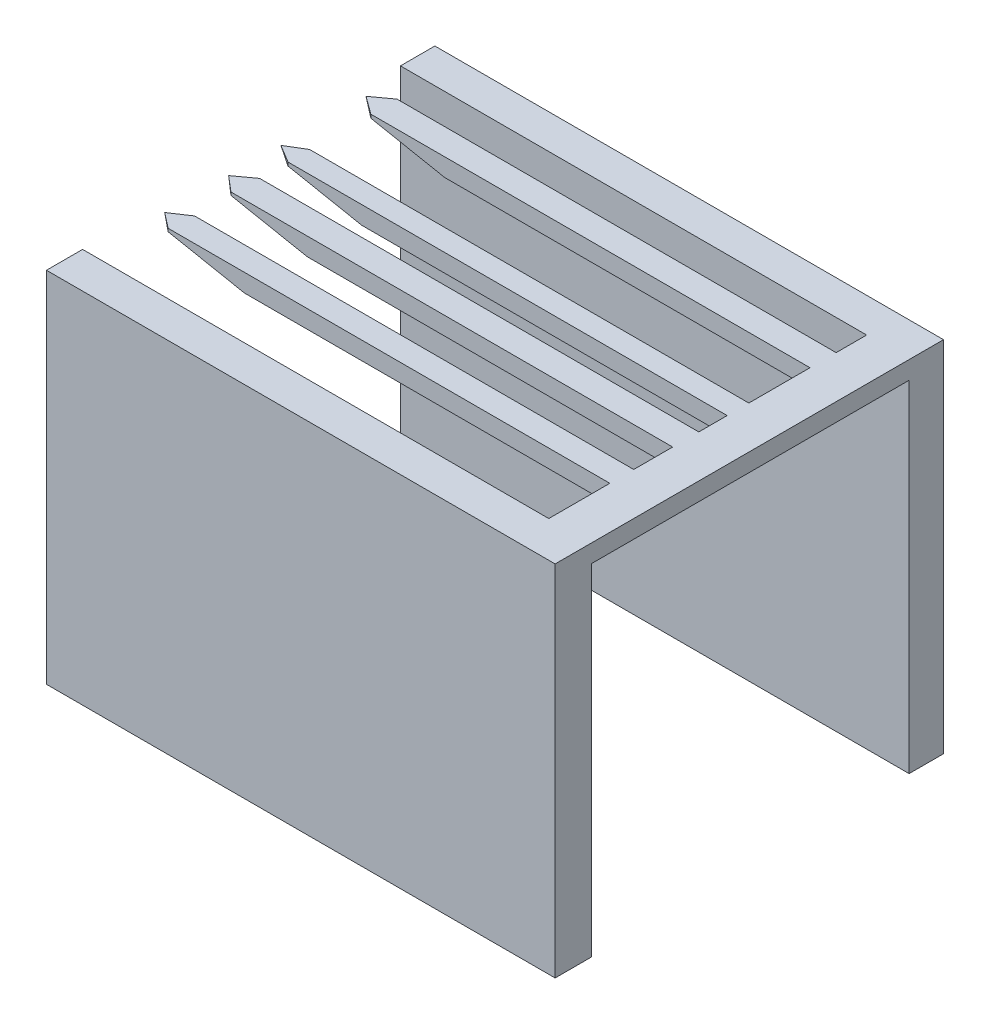
ISO-10303-21;
HEADER;
FILE_DESCRIPTION(('STEP AP214'),'2;1');
FILE_NAME('part.step','',(''),(''),'','','');
FILE_SCHEMA(('AUTOMOTIVE_DESIGN { 1 0 10303 214 1 1 1 1 }'));
ENDSEC;
DATA;
#1=APPLICATION_CONTEXT('core data for automotive mechanical design processes');
#2=APPLICATION_PROTOCOL_DEFINITION('international standard','automotive_design',2000,#1);
#3=PRODUCT_CONTEXT('',#1,'mechanical');
#4=PRODUCT('Part','Part','',(#3));
#5=PRODUCT_RELATED_PRODUCT_CATEGORY('part','',(#4));
#6=PRODUCT_DEFINITION_FORMATION('','',#4);
#7=PRODUCT_DEFINITION_CONTEXT('part definition',#1,'design');
#8=PRODUCT_DEFINITION('design','',#6,#7);
#9=PRODUCT_DEFINITION_SHAPE('','',#8);
#10=(LENGTH_UNIT() NAMED_UNIT(*) SI_UNIT(.MILLI.,.METRE.));
#11=(NAMED_UNIT(*) PLANE_ANGLE_UNIT() SI_UNIT($,.RADIAN.));
#12=(NAMED_UNIT(*) SI_UNIT($,.STERADIAN.) SOLID_ANGLE_UNIT());
#13=UNCERTAINTY_MEASURE_WITH_UNIT(LENGTH_MEASURE(1.E-05),#10,'distance_accuracy_value','');
#14=(GEOMETRIC_REPRESENTATION_CONTEXT(3) GLOBAL_UNCERTAINTY_ASSIGNED_CONTEXT((#13)) GLOBAL_UNIT_ASSIGNED_CONTEXT((#10,
#11,#12)) REPRESENTATION_CONTEXT('',''));
#15=CARTESIAN_POINT('',(0.,0.,0.));
#16=DIRECTION('',(0.,0.,1.));
#17=DIRECTION('',(1.,0.,0.));
#18=AXIS2_PLACEMENT_3D('',#15,#16,#17);
#19=CARTESIAN_POINT('',(0.,95.,0.));
#20=DIRECTION('',(0.,1.,0.));
#21=DIRECTION('',(0.,0.,1.));
#22=AXIS2_PLACEMENT_3D('',#19,#20,#21);
#23=PLANE('',#22);
#24=DIRECTION('',(0.,0.,-1.));
#25=VECTOR('',#24,1.);
#26=CARTESIAN_POINT('',(-26.0345797095387,95.,85.9286159941062));
#27=LINE('',#26,#25);
#28=CARTESIAN_POINT('',(-26.0345797095387,95.,20.9286159941062));
#29=VERTEX_POINT('',#28);
#30=CARTESIAN_POINT('',(-26.0345797095387,95.,13.6408421843065));
#31=VERTEX_POINT('',#30);
#32=EDGE_CURVE('E261',#29,#31,#27,.T.);
#33=ORIENTED_EDGE('',*,*,#32,.T.);
#34=DIRECTION('',(1.,0.,0.));
#35=VECTOR('',#34,1.);
#36=CARTESIAN_POINT('',(0.,95.,13.6408421843065));
#37=LINE('',#36,#35);
#38=CARTESIAN_POINT('',(75.8457437898929,95.,13.6408421843065));
#39=VERTEX_POINT('',#38);
#40=EDGE_CURVE('E297',#31,#39,#37,.T.);
#41=ORIENTED_EDGE('',*,*,#40,.T.);
#42=DIRECTION('',(0.,0.,1.));
#43=VECTOR('',#42,1.);
#44=CARTESIAN_POINT('',(75.8457437898929,95.,0.));
#45=LINE('',#44,#43);
#46=CARTESIAN_POINT('',(75.8457437898929,95.,5.13862822737356));
#47=VERTEX_POINT('',#46);
#48=EDGE_CURVE('E293',#47,#39,#45,.T.);
#49=ORIENTED_EDGE('',*,*,#48,.F.);
#50=DIRECTION('',(1.,0.,0.));
#51=VECTOR('',#50,1.);
#52=CARTESIAN_POINT('',(0.,95.,5.13862822737356));
#53=LINE('',#52,#51);
#54=CARTESIAN_POINT('',(87.6897438341907,95.,5.13862822737356));
#55=VERTEX_POINT('',#54);
#56=EDGE_CURVE('E290',#47,#55,#53,.T.);
#57=ORIENTED_EDGE('',*,*,#56,.T.);
#58=DIRECTION('',(0.,0.,1.));
#59=VECTOR('',#58,1.);
#60=CARTESIAN_POINT('',(87.6897438341907,95.,0.));
#61=LINE('',#60,#59);
#62=CARTESIAN_POINT('',(87.6897438341907,95.,93.7695971739275));
#63=VERTEX_POINT('',#62);
#64=EDGE_CURVE('E282',#55,#63,#61,.T.);
#65=ORIENTED_EDGE('',*,*,#64,.T.);
#66=DIRECTION('',(1.,0.,0.));
#67=VECTOR('',#66,1.);
#68=CARTESIAN_POINT('',(0.,95.,93.7695971739275));
#69=LINE('',#68,#67);
#70=CARTESIAN_POINT('',(75.8457437898929,95.,93.7695971739275));
#71=VERTEX_POINT('',#70);
#72=EDGE_CURVE('E50',#71,#63,#69,.T.);
#73=ORIENTED_EDGE('',*,*,#72,.F.);
#74=DIRECTION('',(0.,0.,1.));
#75=VECTOR('',#74,1.);
#76=CARTESIAN_POINT('',(75.8457437898929,95.,0.));
#77=LINE('',#76,#75);
#78=CARTESIAN_POINT('',(75.8457437898929,95.,76.7498621968269));
#79=VERTEX_POINT('',#78);
#80=EDGE_CURVE('E276',#79,#71,#77,.T.);
#81=ORIENTED_EDGE('',*,*,#80,.F.);
#82=DIRECTION('',(1.,0.,0.));
#83=VECTOR('',#82,1.);
#84=CARTESIAN_POINT('',(0.,95.,76.7498621968269));
#85=LINE('',#84,#83);
#86=CARTESIAN_POINT('',(-26.0345797095387,95.,76.7498621968269));
#87=VERTEX_POINT('',#86);
#88=EDGE_CURVE('E265',#87,#79,#85,.T.);
#89=ORIENTED_EDGE('',*,*,#88,.F.);
#90=CARTESIAN_POINT('',(-26.0345797095387,95.,70.0823244559463));
#91=VERTEX_POINT('',#90);
#92=EDGE_CURVE('E248',#87,#91,#27,.T.);
#93=ORIENTED_EDGE('',*,*,#92,.T.);
#94=DIRECTION('',(1.,0.,0.));
#95=VECTOR('',#94,1.);
#96=CARTESIAN_POINT('',(0.,95.,70.0823244559463));
#97=LINE('',#96,#95);
#98=CARTESIAN_POINT('',(75.8457437898929,95.,70.0823244559463));
#99=VERTEX_POINT('',#98);
#100=EDGE_CURVE('E278',#91,#99,#97,.T.);
#101=ORIENTED_EDGE('',*,*,#100,.T.);
#102=DIRECTION('',(0.,0.,1.));
#103=VECTOR('',#102,1.);
#104=CARTESIAN_POINT('',(75.8457437898929,95.,0.));
#105=LINE('',#104,#103);
#106=CARTESIAN_POINT('',(75.8457437898929,95.,59.2281932498617));
#107=VERTEX_POINT('',#106);
#108=EDGE_CURVE('E284',#107,#99,#105,.T.);
#109=ORIENTED_EDGE('',*,*,#108,.F.);
#110=DIRECTION('',(1.,0.,0.));
#111=VECTOR('',#110,1.);
#112=CARTESIAN_POINT('',(0.,95.,59.2281932498617));
#113=LINE('',#112,#111);
#114=CARTESIAN_POINT('',(-26.0345797095387,95.,59.2281932498617));
#115=VERTEX_POINT('',#114);
#116=EDGE_CURVE('E549',#115,#107,#113,.T.);
#117=ORIENTED_EDGE('',*,*,#116,.F.);
#118=CARTESIAN_POINT('',(-26.0345797095387,95.,51.9404194400621));
#119=VERTEX_POINT('',#118);
#120=EDGE_CURVE('E259',#115,#119,#27,.T.);
#121=ORIENTED_EDGE('',*,*,#120,.T.);
#122=DIRECTION('',(1.,0.,0.));
#123=VECTOR('',#122,1.);
#124=CARTESIAN_POINT('',(0.,95.,51.9404194400621));
#125=LINE('',#124,#123);
#126=CARTESIAN_POINT('',(75.8457437898929,95.,51.9404194400621));
#127=VERTEX_POINT('',#126);
#128=EDGE_CURVE('E546',#119,#127,#125,.T.);
#129=ORIENTED_EDGE('',*,*,#128,.T.);
#130=DIRECTION('',(0.,0.,1.));
#131=VECTOR('',#130,1.);
#132=CARTESIAN_POINT('',(75.8457437898929,95.,0.));
#133=LINE('',#132,#131);
#134=CARTESIAN_POINT('',(75.8457437898929,95.,44.0324095613434));
#135=VERTEX_POINT('',#134);
#136=EDGE_CURVE('E542',#135,#127,#133,.T.);
#137=ORIENTED_EDGE('',*,*,#136,.F.);
#138=DIRECTION('',(1.,0.,0.));
#139=VECTOR('',#138,1.);
#140=CARTESIAN_POINT('',(0.,95.,44.0324095613434));
#141=LINE('',#140,#139);
#142=CARTESIAN_POINT('',(-26.0345797095387,95.,44.0324095613434));
#143=VERTEX_POINT('',#142);
#144=EDGE_CURVE('E539',#143,#135,#141,.T.);
#145=ORIENTED_EDGE('',*,*,#144,.F.);
#146=CARTESIAN_POINT('',(-26.0345797095387,95.,37.985107889382));
#147=VERTEX_POINT('',#146);
#148=EDGE_CURVE('E1035',#143,#147,#27,.T.);
#149=ORIENTED_EDGE('',*,*,#148,.T.);
#150=DIRECTION('',(1.,0.,0.));
#151=VECTOR('',#150,1.);
#152=CARTESIAN_POINT('',(0.,95.,37.985107889382));
#153=LINE('',#152,#151);
#154=CARTESIAN_POINT('',(75.8457437898929,95.,37.985107889382));
#155=VERTEX_POINT('',#154);
#156=EDGE_CURVE('E536',#147,#155,#153,.T.);
#157=ORIENTED_EDGE('',*,*,#156,.T.);
#158=DIRECTION('',(0.,0.,1.));
#159=VECTOR('',#158,1.);
#160=CARTESIAN_POINT('',(75.8457437898929,95.,0.));
#161=LINE('',#160,#159);
#162=CARTESIAN_POINT('',(75.8457437898929,95.,20.9286159941062));
#163=VERTEX_POINT('',#162);
#164=EDGE_CURVE('E532',#163,#155,#161,.T.);
#165=ORIENTED_EDGE('',*,*,#164,.F.);
#166=DIRECTION('',(1.,0.,0.));
#167=VECTOR('',#166,1.);
#168=CARTESIAN_POINT('',(0.,95.,20.9286159941062));
#169=LINE('',#168,#167);
#170=EDGE_CURVE('E389',#29,#163,#169,.T.);
#171=ORIENTED_EDGE('',*,*,#170,.F.);
#172=EDGE_LOOP('',(#33,#41,#49,#57,#65,#73,#81,#89,#93,#101,#109,#117,#121,#129,#137,#145,#149,
#157,#165,#171));
#173=FACE_BOUND('',#172,.T.);
#174=ADVANCED_FACE('F41',(#173),#23,.F.);
#175=CARTESIAN_POINT('',(-9.66693073045156,95.,-13.2705990122269));
#176=DIRECTION('',(0.588792424478479,0.,0.80828428221558));
#177=DIRECTION('',(0.80828428221558,0.,-0.588792424478479));
#178=AXIS2_PLACEMENT_3D('',#175,#176,#177);
#179=PLANE('',#178);
#180=DIRECTION('',(0.798380003234807,-0.156066563926737,-0.5815776801588));
#181=VECTOR('',#180,1.);
#182=CARTESIAN_POINT('',(-10.0655938309638,91.8783978238859,-12.9801939917837));
#183=LINE('',#182,#181);
#184=CARTESIAN_POINT('',(-51.612768372986,100.,17.2847290892063));
#185=VERTEX_POINT('',#184);
#186=CARTESIAN_POINT('',(-46.6105020581459,99.0221617369668,13.6408421843065));
#187=VERTEX_POINT('',#186);
#188=EDGE_CURVE('E643',#185,#187,#183,.T.);
#189=ORIENTED_EDGE('',*,*,#188,.F.);
#190=DIRECTION('',(0.80828428221558,0.,-0.588792424478479));
#191=VECTOR('',#190,1.);
#192=CARTESIAN_POINT('',(-9.66693073045156,100.,-13.2705990122269));
#193=LINE('',#192,#191);
#194=CARTESIAN_POINT('',(-46.6105020581459,100.,13.6408421843065));
#195=VERTEX_POINT('',#194);
#196=EDGE_CURVE('E301',#185,#195,#193,.T.);
#197=ORIENTED_EDGE('',*,*,#196,.T.);
#198=DIRECTION('',(0.,1.,0.));
#199=VECTOR('',#198,1.);
#200=CARTESIAN_POINT('',(-46.6105020581459,95.,13.6408421843065));
#201=LINE('',#200,#199);
#202=EDGE_CURVE('E390',#187,#195,#201,.T.);
#203=ORIENTED_EDGE('',*,*,#202,.F.);
#204=EDGE_LOOP('',(#189,#197,#203));
#205=FACE_BOUND('',#204,.T.);
#206=ADVANCED_FACE('F642',(#205),#179,.F.);
#207=CARTESIAN_POINT('',(0.,95.,13.6408421843065));
#208=DIRECTION('',(0.,0.,1.));
#209=DIRECTION('',(1.,0.,0.));
#210=AXIS2_PLACEMENT_3D('',#207,#208,#209);
#211=PLANE('',#210);
#212=DIRECTION('',(0.981424658636506,-0.191847959124451,0.));
#213=VECTOR('',#212,1.);
#214=CARTESIAN_POINT('',(-0.958219353246181,90.0980969203405,13.6408421843065));
#215=LINE('',#214,#213);
#216=EDGE_CURVE('E639',#187,#31,#215,.T.);
#217=ORIENTED_EDGE('',*,*,#216,.F.);
#218=ORIENTED_EDGE('',*,*,#202,.T.);
#219=DIRECTION('',(1.,0.,0.));
#220=VECTOR('',#219,1.);
#221=CARTESIAN_POINT('',(0.,100.,13.6408421843065));
#222=LINE('',#221,#220);
#223=CARTESIAN_POINT('',(75.8457437898929,100.,13.6408421843065));
#224=VERTEX_POINT('',#223);
#225=EDGE_CURVE('E385',#195,#224,#222,.T.);
#226=ORIENTED_EDGE('',*,*,#225,.T.);
#227=DIRECTION('',(0.,1.,0.));
#228=VECTOR('',#227,1.);
#229=CARTESIAN_POINT('',(75.8457437898929,95.,13.6408421843065));
#230=LINE('',#229,#228);
#231=EDGE_CURVE('E394',#39,#224,#230,.T.);
#232=ORIENTED_EDGE('',*,*,#231,.F.);
#233=ORIENTED_EDGE('',*,*,#40,.F.);
#234=EDGE_LOOP('',(#217,#218,#226,#232,#233));
#235=FACE_BOUND('',#234,.T.);
#236=ADVANCED_FACE('F637',(#235),#211,.F.);
#237=CARTESIAN_POINT('',(0.,95.,76.7498621968269));
#238=DIRECTION('',(0.,0.,1.));
#239=DIRECTION('',(1.,0.,0.));
#240=AXIS2_PLACEMENT_3D('',#237,#238,#239);
#241=PLANE('',#240);
#242=DIRECTION('',(0.,1.,0.));
#243=VECTOR('',#242,1.);
#244=CARTESIAN_POINT('',(-47.3197879004241,95.,76.7498621968269));
#245=LINE('',#244,#243);
#246=CARTESIAN_POINT('',(-47.3197879004241,99.1608122590211,76.7498621968269));
#247=VERTEX_POINT('',#246);
#248=CARTESIAN_POINT('',(-47.3197879004241,100.,76.7498621968269));
#249=VERTEX_POINT('',#248);
#250=EDGE_CURVE('E268',#247,#249,#245,.T.);
#251=ORIENTED_EDGE('',*,*,#250,.F.);
#252=DIRECTION('',(0.981424658636506,-0.191847959124451,0.));
#253=VECTOR('',#252,1.);
#254=CARTESIAN_POINT('',(-0.958219353246181,90.0980969203405,76.7498621968269));
#255=LINE('',#254,#253);
#256=EDGE_CURVE('E251',#247,#87,#255,.T.);
#257=ORIENTED_EDGE('',*,*,#256,.T.);
#258=ORIENTED_EDGE('',*,*,#88,.T.);
#259=DIRECTION('',(0.,1.,0.));
#260=VECTOR('',#259,1.);
#261=CARTESIAN_POINT('',(75.8457437898929,95.,76.7498621968269));
#262=LINE('',#261,#260);
#263=CARTESIAN_POINT('',(75.8457437898929,100.,76.7498621968269));
#264=VERTEX_POINT('',#263);
#265=EDGE_CURVE('E405',#79,#264,#262,.T.);
#266=ORIENTED_EDGE('',*,*,#265,.T.);
#267=DIRECTION('',(1.,0.,0.));
#268=VECTOR('',#267,1.);
#269=CARTESIAN_POINT('',(0.,100.,76.7498621968269));
#270=LINE('',#269,#268);
#271=EDGE_CURVE('E370',#249,#264,#270,.T.);
#272=ORIENTED_EDGE('',*,*,#271,.F.);
#273=EDGE_LOOP('',(#251,#257,#258,#266,#272));
#274=FACE_BOUND('',#273,.T.);
#275=ADVANCED_FACE('F264',(#274),#241,.T.);
#276=CARTESIAN_POINT('',(-54.9809966350981,95.,70.8004526076518));
#277=DIRECTION('',(0.613342518914027,0.,-0.789817038618563));
#278=DIRECTION('',(-0.789817038618563,0.,-0.613342518914027));
#279=AXIS2_PLACEMENT_3D('',#276,#277,#278);
#280=PLANE('',#279);
#281=DIRECTION('',(-0.780568582148247,0.152584804267967,-0.606160511803252));
#282=VECTOR('',#281,1.);
#283=CARTESIAN_POINT('',(-54.3070626104895,100.526678075792,71.3238046905067));
#284=LINE('',#283,#282);
#285=CARTESIAN_POINT('',(-51.612768372986,100.,73.4160933263866));
#286=VERTEX_POINT('',#285);
#287=EDGE_CURVE('E271',#247,#286,#284,.T.);
#288=ORIENTED_EDGE('',*,*,#287,.F.);
#289=ORIENTED_EDGE('',*,*,#250,.T.);
#290=DIRECTION('',(-0.789817038618563,0.,-0.613342518914027));
#291=VECTOR('',#290,1.);
#292=CARTESIAN_POINT('',(-54.9809966350981,100.,70.8004526076518));
#293=LINE('',#292,#291);
#294=EDGE_CURVE('E366',#249,#286,#293,.T.);
#295=ORIENTED_EDGE('',*,*,#294,.T.);
#296=EDGE_LOOP('',(#288,#289,#295));
#297=FACE_BOUND('',#296,.T.);
#298=ADVANCED_FACE('F593',(#297),#280,.F.);
#299=CARTESIAN_POINT('',(18.0063853558117,95.,27.0182902348328));
#300=DIRECTION('',(0.554576347329292,0.,0.832132846955882));
#301=DIRECTION('',(0.832132846955882,0.,-0.554576347329292));
#302=AXIS2_PLACEMENT_3D('',#299,#300,#301);
#303=PLANE('',#302);
#304=DIRECTION('',(0.821337596163026,-0.160554292364096,-0.547381834127336));
#305=VECTOR('',#304,1.);
#306=CARTESIAN_POINT('',(16.8711114163857,86.6128362937523,27.774895477431));
#307=LINE('',#306,#305);
#308=CARTESIAN_POINT('',(-46.6105020581459,99.0221617369668,70.0823244559463));
#309=VERTEX_POINT('',#308);
#310=EDGE_CURVE('E57',#286,#309,#307,.T.);
#311=ORIENTED_EDGE('',*,*,#310,.F.);
#312=DIRECTION('',(0.832132846955882,0.,-0.554576347329292));
#313=VECTOR('',#312,1.);
#314=CARTESIAN_POINT('',(18.0063853558117,100.,27.0182902348328));
#315=LINE('',#314,#313);
#316=CARTESIAN_POINT('',(-46.6105020581459,100.,70.0823244559463));
#317=VERTEX_POINT('',#316);
#318=EDGE_CURVE('E362',#286,#317,#315,.T.);
#319=ORIENTED_EDGE('',*,*,#318,.T.);
#320=DIRECTION('',(0.,1.,0.));
#321=VECTOR('',#320,1.);
#322=CARTESIAN_POINT('',(-46.6105020581459,95.,70.0823244559463));
#323=LINE('',#322,#321);
#324=EDGE_CURVE('E410',#309,#317,#323,.T.);
#325=ORIENTED_EDGE('',*,*,#324,.F.);
#326=EDGE_LOOP('',(#311,#319,#325));
#327=FACE_BOUND('',#326,.T.);
#328=ADVANCED_FACE('F591',(#327),#303,.F.);
#329=CARTESIAN_POINT('',(0.,95.,70.0823244559463));
#330=DIRECTION('',(0.,0.,1.));
#331=DIRECTION('',(1.,0.,0.));
#332=AXIS2_PLACEMENT_3D('',#329,#330,#331);
#333=PLANE('',#332);
#334=DIRECTION('',(0.981424658636506,-0.191847959124451,0.));
#335=VECTOR('',#334,1.);
#336=CARTESIAN_POINT('',(-0.958219353246181,90.0980969203405,70.0823244559463));
#337=LINE('',#336,#335);
#338=EDGE_CURVE('E253',#309,#91,#337,.T.);
#339=ORIENTED_EDGE('',*,*,#338,.F.);
#340=ORIENTED_EDGE('',*,*,#324,.T.);
#341=DIRECTION('',(1.,0.,0.));
#342=VECTOR('',#341,1.);
#343=CARTESIAN_POINT('',(0.,100.,70.0823244559463));
#344=LINE('',#343,#342);
#345=CARTESIAN_POINT('',(75.8457437898929,100.,70.0823244559463));
#346=VERTEX_POINT('',#345);
#347=EDGE_CURVE('E358',#317,#346,#344,.T.);
#348=ORIENTED_EDGE('',*,*,#347,.T.);
#349=DIRECTION('',(0.,1.,0.));
#350=VECTOR('',#349,1.);
#351=CARTESIAN_POINT('',(75.8457437898929,95.,70.0823244559463));
#352=LINE('',#351,#350);
#353=EDGE_CURVE('E413',#99,#346,#352,.T.);
#354=ORIENTED_EDGE('',*,*,#353,.F.);
#355=ORIENTED_EDGE('',*,*,#100,.F.);
#356=EDGE_LOOP('',(#339,#340,#348,#354,#355));
#357=FACE_BOUND('',#356,.T.);
#358=ADVANCED_FACE('F562',(#357),#333,.F.);
#359=CARTESIAN_POINT('',(0.,95.,59.2281932498617));
#360=DIRECTION('',(0.,0.,1.));
#361=DIRECTION('',(1.,0.,0.));
#362=AXIS2_PLACEMENT_3D('',#359,#360,#361);
#363=PLANE('',#362);
#364=DIRECTION('',(0.,1.,0.));
#365=VECTOR('',#364,1.);
#366=CARTESIAN_POINT('',(-47.3197879004241,95.,59.2281932498617));
#367=LINE('',#366,#365);
#368=CARTESIAN_POINT('',(-47.3197879004241,99.1608122590211,59.2281932498617));
#369=VERTEX_POINT('',#368);
#370=CARTESIAN_POINT('',(-47.3197879004241,100.,59.2281932498617));
#371=VERTEX_POINT('',#370);
#372=EDGE_CURVE('E419',#369,#371,#367,.T.);
#373=ORIENTED_EDGE('',*,*,#372,.F.);
#374=DIRECTION('',(0.981424658636506,-0.191847959124451,0.));
#375=VECTOR('',#374,1.);
#376=CARTESIAN_POINT('',(-0.958219353246181,90.0980969203405,59.2281932498617));
#377=LINE('',#376,#375);
#378=EDGE_CURVE('E575',#369,#115,#377,.T.);
#379=ORIENTED_EDGE('',*,*,#378,.T.);
#380=ORIENTED_EDGE('',*,*,#116,.T.);
#381=DIRECTION('',(0.,1.,0.));
#382=VECTOR('',#381,1.);
#383=CARTESIAN_POINT('',(75.8457437898929,95.,59.2281932498617));
#384=LINE('',#383,#382);
#385=CARTESIAN_POINT('',(75.8457437898929,100.,59.2281932498617));
#386=VERTEX_POINT('',#385);
#387=EDGE_CURVE('E416',#107,#386,#384,.T.);
#388=ORIENTED_EDGE('',*,*,#387,.T.);
#389=DIRECTION('',(1.,0.,0.));
#390=VECTOR('',#389,1.);
#391=CARTESIAN_POINT('',(0.,100.,59.2281932498617));
#392=LINE('',#391,#390);
#393=EDGE_CURVE('E350',#371,#386,#392,.T.);
#394=ORIENTED_EDGE('',*,*,#393,.F.);
#395=EDGE_LOOP('',(#373,#379,#380,#388,#394));
#396=FACE_BOUND('',#395,.T.);
#397=ADVANCED_FACE('F573',(#396),#363,.T.);
#398=CARTESIAN_POINT('',(-49.0362862169957,95.,57.7712274476611));
#399=DIRECTION('',(0.647117658668542,0.,-0.762390146735479));
#400=DIRECTION('',(-0.762390146735479,0.,-0.647117658668542));
#401=AXIS2_PLACEMENT_3D('',#398,#399,#400);
#402=PLANE('',#401);
#403=DIRECTION('',(-0.754062150565573,0.147403352224697,-0.640048845665192));
#404=VECTOR('',#403,1.);
#405=CARTESIAN_POINT('',(-48.5365109287484,99.3986561197287,58.1954373036984));
#406=LINE('',#405,#404);
#407=CARTESIAN_POINT('',(-51.612768372986,100.,55.5843063449619));
#408=VERTEX_POINT('',#407);
#409=EDGE_CURVE('E578',#369,#408,#406,.T.);
#410=ORIENTED_EDGE('',*,*,#409,.F.);
#411=ORIENTED_EDGE('',*,*,#372,.T.);
#412=DIRECTION('',(-0.762390146735479,0.,-0.647117658668542));
#413=VECTOR('',#412,1.);
#414=CARTESIAN_POINT('',(-49.0362862169957,100.,57.7712274476611));
#415=LINE('',#414,#413);
#416=EDGE_CURVE('E346',#371,#408,#415,.T.);
#417=ORIENTED_EDGE('',*,*,#416,.T.);
#418=EDGE_LOOP('',(#410,#411,#417));
#419=FACE_BOUND('',#418,.T.);
#420=ADVANCED_FACE('F701',(#419),#402,.F.);
#421=CARTESIAN_POINT('',(8.56028474264569,95.,11.7514141166116));
#422=DIRECTION('',(0.588792424478478,0.,0.80828428221558));
#423=DIRECTION('',(0.80828428221558,0.,-0.588792424478478));
#424=AXIS2_PLACEMENT_3D('',#421,#422,#423);
#425=PLANE('',#424);
#426=DIRECTION('',(0.798380003234807,-0.156066563926737,-0.5815776801588));
#427=VECTOR('',#426,1.);
#428=CARTESIAN_POINT('',(7.71766550380877,88.4021431975788,12.3652177442005));
#429=LINE('',#428,#427);
#430=CARTESIAN_POINT('',(-46.6105020581459,99.0221617369668,51.9404194400621));
#431=VERTEX_POINT('',#430);
#432=EDGE_CURVE('E65',#408,#431,#429,.T.);
#433=ORIENTED_EDGE('',*,*,#432,.F.);
#434=DIRECTION('',(0.80828428221558,0.,-0.588792424478478));
#435=VECTOR('',#434,1.);
#436=CARTESIAN_POINT('',(8.56028474264569,100.,11.7514141166116));
#437=LINE('',#436,#435);
#438=CARTESIAN_POINT('',(-46.6105020581459,100.,51.9404194400621));
#439=VERTEX_POINT('',#438);
#440=EDGE_CURVE('E342',#408,#439,#437,.T.);
#441=ORIENTED_EDGE('',*,*,#440,.T.);
#442=DIRECTION('',(0.,1.,0.));
#443=VECTOR('',#442,1.);
#444=CARTESIAN_POINT('',(-46.6105020581459,95.,51.9404194400621));
#445=LINE('',#444,#443);
#446=EDGE_CURVE('E422',#431,#439,#445,.T.);
#447=ORIENTED_EDGE('',*,*,#446,.F.);
#448=EDGE_LOOP('',(#433,#441,#447));
#449=FACE_BOUND('',#448,.T.);
#450=ADVANCED_FACE('F698',(#449),#425,.F.);
#451=CARTESIAN_POINT('',(0.,95.,51.9404194400621));
#452=DIRECTION('',(0.,0.,1.));
#453=DIRECTION('',(1.,0.,0.));
#454=AXIS2_PLACEMENT_3D('',#451,#452,#453);
#455=PLANE('',#454);
#456=DIRECTION('',(0.981424658636506,-0.191847959124451,0.));
#457=VECTOR('',#456,1.);
#458=CARTESIAN_POINT('',(-0.958219353246181,90.0980969203405,51.9404194400621));
#459=LINE('',#458,#457);
#460=EDGE_CURVE('E696',#431,#119,#459,.T.);
#461=ORIENTED_EDGE('',*,*,#460,.F.);
#462=ORIENTED_EDGE('',*,*,#446,.T.);
#463=DIRECTION('',(1.,0.,0.));
#464=VECTOR('',#463,1.);
#465=CARTESIAN_POINT('',(0.,100.,51.9404194400621));
#466=LINE('',#465,#464);
#467=CARTESIAN_POINT('',(75.8457437898929,100.,51.9404194400621));
#468=VERTEX_POINT('',#467);
#469=EDGE_CURVE('E338',#439,#468,#466,.T.);
#470=ORIENTED_EDGE('',*,*,#469,.T.);
#471=DIRECTION('',(0.,1.,0.));
#472=VECTOR('',#471,1.);
#473=CARTESIAN_POINT('',(75.8457437898929,95.,51.9404194400621));
#474=LINE('',#473,#472);
#475=EDGE_CURVE('E425',#127,#468,#474,.T.);
#476=ORIENTED_EDGE('',*,*,#475,.F.);
#477=ORIENTED_EDGE('',*,*,#128,.F.);
#478=EDGE_LOOP('',(#461,#462,#470,#476,#477));
#479=FACE_BOUND('',#478,.T.);
#480=ADVANCED_FACE('F693',(#479),#455,.F.);
#481=CARTESIAN_POINT('',(0.,95.,44.0324095613434));
#482=DIRECTION('',(0.,0.,1.));
#483=DIRECTION('',(1.,0.,0.));
#484=AXIS2_PLACEMENT_3D('',#481,#482,#483);
#485=PLANE('',#484);
#486=DIRECTION('',(0.,1.,0.));
#487=VECTOR('',#486,1.);
#488=CARTESIAN_POINT('',(-46.6105020581459,95.,44.0324095613434));
#489=LINE('',#488,#487);
#490=CARTESIAN_POINT('',(-46.6105020581459,99.0221617369668,44.0324095613434));
#491=VERTEX_POINT('',#490);
#492=CARTESIAN_POINT('',(-46.6105020581459,100.,44.0324095613434));
#493=VERTEX_POINT('',#492);
#494=EDGE_CURVE('E431',#491,#493,#489,.T.);
#495=ORIENTED_EDGE('',*,*,#494,.F.);
#496=DIRECTION('',(0.981424658636506,-0.191847959124451,0.));
#497=VECTOR('',#496,1.);
#498=CARTESIAN_POINT('',(-0.958219353246181,90.0980969203405,44.0324095613434));
#499=LINE('',#498,#497);
#500=EDGE_CURVE('E1047',#491,#143,#499,.T.);
#501=ORIENTED_EDGE('',*,*,#500,.T.);
#502=ORIENTED_EDGE('',*,*,#144,.T.);
#503=DIRECTION('',(0.,1.,0.));
#504=VECTOR('',#503,1.);
#505=CARTESIAN_POINT('',(75.8457437898929,95.,44.0324095613434));
#506=LINE('',#505,#504);
#507=CARTESIAN_POINT('',(75.8457437898929,100.,44.0324095613434));
#508=VERTEX_POINT('',#507);
#509=EDGE_CURVE('E428',#135,#508,#506,.T.);
#510=ORIENTED_EDGE('',*,*,#509,.T.);
#511=DIRECTION('',(1.,0.,0.));
#512=VECTOR('',#511,1.);
#513=CARTESIAN_POINT('',(0.,100.,44.0324095613434));
#514=LINE('',#513,#512);
#515=EDGE_CURVE('E330',#493,#508,#514,.T.);
#516=ORIENTED_EDGE('',*,*,#515,.F.);
#517=EDGE_LOOP('',(#495,#501,#502,#510,#516));
#518=FACE_BOUND('',#517,.T.);
#519=ADVANCED_FACE('F682',(#518),#485,.T.);
#520=CARTESIAN_POINT('',(-31.9662083402864,95.,52.8842435412719));
#521=DIRECTION('',(0.517297146436974,0.,-0.85580585548836));
#522=DIRECTION('',(-0.85580585548836,0.,-0.517297146436974));
#523=AXIS2_PLACEMENT_3D('',#520,#521,#522);
#524=PLANE('',#523);
#525=DIRECTION('',(-0.844075929965487,0.164999160236026,-0.510206920351248));
#526=VECTOR('',#525,1.);
#527=CARTESIAN_POINT('',(-31.8047213945955,96.1279418103016,52.9818553251326));
#528=LINE('',#527,#526);
#529=CARTESIAN_POINT('',(-51.612768372986,100.,41.0087587253627));
#530=VERTEX_POINT('',#529);
#531=EDGE_CURVE('E674',#491,#530,#528,.T.);
#532=ORIENTED_EDGE('',*,*,#531,.F.);
#533=ORIENTED_EDGE('',*,*,#494,.T.);
#534=DIRECTION('',(-0.85580585548836,0.,-0.517297146436974));
#535=VECTOR('',#534,1.);
#536=CARTESIAN_POINT('',(-31.9662083402864,100.,52.8842435412719));
#537=LINE('',#536,#535);
#538=EDGE_CURVE('E326',#493,#530,#537,.T.);
#539=ORIENTED_EDGE('',*,*,#538,.T.);
#540=EDGE_LOOP('',(#532,#533,#539));
#541=FACE_BOUND('',#540,.T.);
#542=ADVANCED_FACE('F678',(#541),#524,.F.);
#543=CARTESIAN_POINT('',(4.34343274872568,95.,7.18568661142272));
#544=DIRECTION('',(0.517297146436974,0.,0.85580585548836));
#545=DIRECTION('',(0.85580585548836,0.,-0.517297146436974));
#546=AXIS2_PLACEMENT_3D('',#543,#544,#545);
#547=PLANE('',#546);
#548=DIRECTION('',(0.844075929965487,-0.164999160236026,-0.510206920351248));
#549=VECTOR('',#548,1.);
#550=CARTESIAN_POINT('',(3.51639977794697,89.2234026270758,7.6855918096046));
#551=LINE('',#550,#549);
#552=CARTESIAN_POINT('',(-46.6105020581459,99.0221617369668,37.985107889382));
#553=VERTEX_POINT('',#552);
#554=EDGE_CURVE('E671',#530,#553,#551,.T.);
#555=ORIENTED_EDGE('',*,*,#554,.F.);
#556=DIRECTION('',(0.85580585548836,0.,-0.517297146436974));
#557=VECTOR('',#556,1.);
#558=CARTESIAN_POINT('',(4.34343274872568,100.,7.18568661142272));
#559=LINE('',#558,#557);
#560=CARTESIAN_POINT('',(-46.6105020581459,100.,37.985107889382));
#561=VERTEX_POINT('',#560);
#562=EDGE_CURVE('E322',#530,#561,#559,.T.);
#563=ORIENTED_EDGE('',*,*,#562,.T.);
#564=DIRECTION('',(0.,1.,0.));
#565=VECTOR('',#564,1.);
#566=CARTESIAN_POINT('',(-46.6105020581459,95.,37.985107889382));
#567=LINE('',#566,#565);
#568=EDGE_CURVE('E434',#553,#561,#567,.T.);
#569=ORIENTED_EDGE('',*,*,#568,.F.);
#570=EDGE_LOOP('',(#555,#563,#569));
#571=FACE_BOUND('',#570,.T.);
#572=ADVANCED_FACE('F670',(#571),#547,.F.);
#573=CARTESIAN_POINT('',(0.,95.,37.985107889382));
#574=DIRECTION('',(0.,0.,1.));
#575=DIRECTION('',(1.,0.,0.));
#576=AXIS2_PLACEMENT_3D('',#573,#574,#575);
#577=PLANE('',#576);
#578=DIRECTION('',(0.981424658636506,-0.191847959124451,0.));
#579=VECTOR('',#578,1.);
#580=CARTESIAN_POINT('',(-0.958219353246181,90.0980969203405,37.985107889382));
#581=LINE('',#580,#579);
#582=EDGE_CURVE('E667',#553,#147,#581,.T.);
#583=ORIENTED_EDGE('',*,*,#582,.F.);
#584=ORIENTED_EDGE('',*,*,#568,.T.);
#585=DIRECTION('',(1.,0.,0.));
#586=VECTOR('',#585,1.);
#587=CARTESIAN_POINT('',(0.,100.,37.985107889382));
#588=LINE('',#587,#586);
#589=CARTESIAN_POINT('',(75.8457437898929,100.,37.985107889382));
#590=VERTEX_POINT('',#589);
#591=EDGE_CURVE('E318',#561,#590,#588,.T.);
#592=ORIENTED_EDGE('',*,*,#591,.T.);
#593=DIRECTION('',(0.,1.,0.));
#594=VECTOR('',#593,1.);
#595=CARTESIAN_POINT('',(75.8457437898929,95.,37.985107889382));
#596=LINE('',#595,#594);
#597=EDGE_CURVE('E437',#155,#590,#596,.T.);
#598=ORIENTED_EDGE('',*,*,#597,.F.);
#599=ORIENTED_EDGE('',*,*,#156,.F.);
#600=EDGE_LOOP('',(#583,#584,#592,#598,#599));
#601=FACE_BOUND('',#600,.T.);
#602=ADVANCED_FACE('F664',(#601),#577,.F.);
#603=CARTESIAN_POINT('',(0.,95.,20.9286159941062));
#604=DIRECTION('',(0.,0.,1.));
#605=DIRECTION('',(1.,0.,0.));
#606=AXIS2_PLACEMENT_3D('',#603,#604,#605);
#607=PLANE('',#606);
#608=DIRECTION('',(0.,1.,0.));
#609=VECTOR('',#608,1.);
#610=CARTESIAN_POINT('',(-46.6105020581459,95.,20.9286159941062));
#611=LINE('',#610,#609);
#612=CARTESIAN_POINT('',(-46.6105020581459,99.0221617369668,20.9286159941062));
#613=VERTEX_POINT('',#612);
#614=CARTESIAN_POINT('',(-46.6105020581459,100.,20.9286159941062));
#615=VERTEX_POINT('',#614);
#616=EDGE_CURVE('E300',#613,#615,#611,.T.);
#617=ORIENTED_EDGE('',*,*,#616,.F.);
#618=DIRECTION('',(0.981424658636506,-0.191847959124451,0.));
#619=VECTOR('',#618,1.);
#620=CARTESIAN_POINT('',(-0.958219353246181,90.0980969203405,20.9286159941062));
#621=LINE('',#620,#619);
#622=EDGE_CURVE('E258',#613,#29,#621,.T.);
#623=ORIENTED_EDGE('',*,*,#622,.T.);
#624=ORIENTED_EDGE('',*,*,#170,.T.);
#625=DIRECTION('',(0.,1.,0.));
#626=VECTOR('',#625,1.);
#627=CARTESIAN_POINT('',(75.8457437898929,95.,20.9286159941062));
#628=LINE('',#627,#626);
#629=CARTESIAN_POINT('',(75.8457437898929,100.,20.9286159941062));
#630=VERTEX_POINT('',#629);
#631=EDGE_CURVE('E440',#163,#630,#628,.T.);
#632=ORIENTED_EDGE('',*,*,#631,.T.);
#633=DIRECTION('',(1.,0.,0.));
#634=VECTOR('',#633,1.);
#635=CARTESIAN_POINT('',(0.,100.,20.9286159941062));
#636=LINE('',#635,#634);
#637=EDGE_CURVE('E310',#615,#630,#636,.T.);
#638=ORIENTED_EDGE('',*,*,#637,.F.);
#639=EDGE_LOOP('',(#617,#623,#624,#632,#638));
#640=FACE_BOUND('',#639,.T.);
#641=ADVANCED_FACE('F650',(#640),#607,.T.);
#642=CARTESIAN_POINT('',(-26.1189390332706,95.,35.8556377613709));
#643=DIRECTION('',(0.588792424478479,0.,-0.80828428221558));
#644=DIRECTION('',(-0.80828428221558,0.,-0.588792424478479));
#645=AXIS2_PLACEMENT_3D('',#642,#643,#644);
#646=PLANE('',#645);
#647=DIRECTION('',(-0.798380003234807,0.156066563926737,-0.5815776801588));
#648=VECTOR('',#647,1.);
#649=CARTESIAN_POINT('',(-26.1168843124247,95.0160888255163,35.8571345170237));
#650=LINE('',#649,#648);
#651=EDGE_CURVE('E11',#613,#185,#650,.T.);
#652=ORIENTED_EDGE('',*,*,#651,.F.);
#653=ORIENTED_EDGE('',*,*,#616,.T.);
#654=DIRECTION('',(-0.80828428221558,0.,-0.588792424478479));
#655=VECTOR('',#654,1.);
#656=CARTESIAN_POINT('',(-26.1189390332706,100.,35.8556377613709));
#657=LINE('',#656,#655);
#658=EDGE_CURVE('E305',#615,#185,#657,.T.);
#659=ORIENTED_EDGE('',*,*,#658,.T.);
#660=EDGE_LOOP('',(#652,#653,#659));
#661=FACE_BOUND('',#660,.T.);
#662=ADVANCED_FACE('F729',(#661),#646,.F.);
#663=CARTESIAN_POINT('',(75.8457437898929,95.,0.));
#664=DIRECTION('',(-1.,0.,0.));
#665=DIRECTION('',(0.,0.,1.));
#666=AXIS2_PLACEMENT_3D('',#663,#664,#665);
#667=PLANE('',#666);
#668=ORIENTED_EDGE('',*,*,#80,.T.);
#669=DIRECTION('',(0.,1.,0.));
#670=VECTOR('',#669,1.);
#671=CARTESIAN_POINT('',(75.8457437898929,95.,93.7695971739275));
#672=LINE('',#671,#670);
#673=CARTESIAN_POINT('',(75.8457437898929,100.,93.7695971739275));
#674=VERTEX_POINT('',#673);
#675=EDGE_CURVE('E306',#71,#674,#672,.T.);
#676=ORIENTED_EDGE('',*,*,#675,.T.);
#677=DIRECTION('',(0.,0.,1.));
#678=VECTOR('',#677,1.);
#679=CARTESIAN_POINT('',(75.8457437898929,100.,0.));
#680=LINE('',#679,#678);
#681=EDGE_CURVE('E374',#264,#674,#680,.T.);
#682=ORIENTED_EDGE('',*,*,#681,.F.);
#683=ORIENTED_EDGE('',*,*,#265,.F.);
#684=EDGE_LOOP('',(#668,#676,#682,#683));
#685=FACE_BOUND('',#684,.T.);
#686=ADVANCED_FACE('F596',(#685),#667,.T.);
#687=CARTESIAN_POINT('',(57.7741748810466,100.,5.13862822737356));
#688=DIRECTION('',(0.,0.,-1.));
#689=DIRECTION('',(-1.,0.,0.));
#690=AXIS2_PLACEMENT_3D('',#687,#688,#689);
#691=PLANE('',#690);
#692=ORIENTED_EDGE('',*,*,#56,.F.);
#693=DIRECTION('',(0.,1.,0.));
#694=VECTOR('',#693,1.);
#695=CARTESIAN_POINT('',(75.8457437898929,95.,5.13862822737356));
#696=LINE('',#695,#694);
#697=CARTESIAN_POINT('',(75.8457437898929,100.,5.13862822737356));
#698=VERTEX_POINT('',#697);
#699=EDGE_CURVE('E397',#47,#698,#696,.T.);
#700=ORIENTED_EDGE('',*,*,#699,.T.);
#701=DIRECTION('',(1.,0.,0.));
#702=VECTOR('',#701,1.);
#703=CARTESIAN_POINT('',(57.7741748810466,100.,5.13862822737356));
#704=LINE('',#703,#702);
#705=CARTESIAN_POINT('',(-54.1532273834971,100.,5.13862822737356));
#706=VERTEX_POINT('',#705);
#707=EDGE_CURVE('E457',#706,#698,#704,.T.);
#708=ORIENTED_EDGE('',*,*,#707,.F.);
#709=DIRECTION('',(0.,-1.,0.));
#710=VECTOR('',#709,1.);
#711=CARTESIAN_POINT('',(-54.1532273834971,100.,5.13862822737356));
#712=LINE('',#711,#710);
#713=CARTESIAN_POINT('',(-54.1532273834971,0.,5.13862822737356));
#714=VERTEX_POINT('',#713);
#715=EDGE_CURVE('E461',#706,#714,#712,.T.);
#716=ORIENTED_EDGE('',*,*,#715,.T.);
#717=DIRECTION('',(-1.,0.,0.));
#718=VECTOR('',#717,1.);
#719=CARTESIAN_POINT('',(0.,0.,5.13862822737356));
#720=LINE('',#719,#718);
#721=CARTESIAN_POINT('',(87.6897438341907,0.,5.13862822737356));
#722=VERTEX_POINT('',#721);
#723=EDGE_CURVE('E482',#722,#714,#720,.T.);
#724=ORIENTED_EDGE('',*,*,#723,.F.);
#725=DIRECTION('',(0.,-1.,0.));
#726=VECTOR('',#725,1.);
#727=CARTESIAN_POINT('',(87.6897438341907,5.,5.13862822737356));
#728=LINE('',#727,#726);
#729=EDGE_CURVE('E393',#55,#722,#728,.T.);
#730=ORIENTED_EDGE('',*,*,#729,.F.);
#731=EDGE_LOOP('',(#692,#700,#708,#716,#724,#730));
#732=FACE_BOUND('',#731,.T.);
#733=ADVANCED_FACE('F626',(#732),#691,.F.);
#734=CARTESIAN_POINT('',(-54.1532273834971,5.,-4.46116369326644));
#735=DIRECTION('',(1.,0.,0.));
#736=DIRECTION('',(0.,0.,-1.));
#737=AXIS2_PLACEMENT_3D('',#734,#735,#736);
#738=PLANE('',#737);
#739=DIRECTION('',(0.,0.,1.));
#740=VECTOR('',#739,1.);
#741=CARTESIAN_POINT('',(-54.1532273834971,0.,-4.46116369326644));
#742=LINE('',#741,#740);
#743=CARTESIAN_POINT('',(-54.1532273834971,0.,-4.46116369326644));
#744=VERTEX_POINT('',#743);
#745=EDGE_CURVE('E464',#744,#714,#742,.T.);
#746=ORIENTED_EDGE('',*,*,#745,.T.);
#747=ORIENTED_EDGE('',*,*,#715,.F.);
#748=DIRECTION('',(0.,0.,1.));
#749=VECTOR('',#748,1.);
#750=CARTESIAN_POINT('',(-54.1532273834971,100.,5.13862822737356));
#751=LINE('',#750,#749);
#752=CARTESIAN_POINT('',(-54.1532273834971,100.,-4.46116369326644));
#753=VERTEX_POINT('',#752);
#754=EDGE_CURVE('E454',#753,#706,#751,.T.);
#755=ORIENTED_EDGE('',*,*,#754,.F.);
#756=DIRECTION('',(0.,-1.,0.));
#757=VECTOR('',#756,1.);
#758=CARTESIAN_POINT('',(-54.1532273834971,5.,-4.46116369326644));
#759=LINE('',#758,#757);
#760=EDGE_CURVE('E474',#753,#744,#759,.T.);
#761=ORIENTED_EDGE('',*,*,#760,.T.);
#762=EDGE_LOOP('',(#746,#747,#755,#761));
#763=FACE_BOUND('',#762,.T.);
#764=ADVANCED_FACE('F43',(#763),#738,.F.);
#765=CARTESIAN_POINT('',(-54.1532273834971,5.,-4.46116369326644));
#766=DIRECTION('',(0.,0.,1.));
#767=DIRECTION('',(1.,0.,0.));
#768=AXIS2_PLACEMENT_3D('',#765,#766,#767);
#769=PLANE('',#768);
#770=DIRECTION('',(-1.,0.,0.));
#771=VECTOR('',#770,1.);
#772=CARTESIAN_POINT('',(-54.1532273834971,0.,-4.46116369326644));
#773=LINE('',#772,#771);
#774=CARTESIAN_POINT('',(87.6897438341907,0.,-4.46116369326644));
#775=VERTEX_POINT('',#774);
#776=EDGE_CURVE('E471',#775,#744,#773,.T.);
#777=ORIENTED_EDGE('',*,*,#776,.T.);
#778=ORIENTED_EDGE('',*,*,#760,.F.);
#779=DIRECTION('',(-1.,0.,0.));
#780=VECTOR('',#779,1.);
#781=CARTESIAN_POINT('',(57.7741748810466,100.,-4.46116369326645));
#782=LINE('',#781,#780);
#783=CARTESIAN_POINT('',(87.6897438341907,100.,-4.46116369326644));
#784=VERTEX_POINT('',#783);
#785=EDGE_CURVE('E450',#784,#753,#782,.T.);
#786=ORIENTED_EDGE('',*,*,#785,.F.);
#787=DIRECTION('',(0.,-1.,0.));
#788=VECTOR('',#787,1.);
#789=CARTESIAN_POINT('',(87.6897438341907,5.,-4.46116369326644));
#790=LINE('',#789,#788);
#791=EDGE_CURVE('E478',#784,#775,#790,.T.);
#792=ORIENTED_EDGE('',*,*,#791,.T.);
#793=EDGE_LOOP('',(#777,#778,#786,#792));
#794=FACE_BOUND('',#793,.T.);
#795=ADVANCED_FACE('F617',(#794),#769,.F.);
#796=CARTESIAN_POINT('',(0.,100.,0.));
#797=DIRECTION('',(0.,-1.,0.));
#798=DIRECTION('',(0.,0.,-1.));
#799=AXIS2_PLACEMENT_3D('',#796,#797,#798);
#800=PLANE('',#799);
#801=DIRECTION('',(0.,0.,-1.));
#802=VECTOR('',#801,1.);
#803=CARTESIAN_POINT('',(87.6897438341907,100.,103.845291073728));
#804=LINE('',#803,#802);
#805=CARTESIAN_POINT('',(87.6897438341907,100.,103.845291073728));
#806=VERTEX_POINT('',#805);
#807=EDGE_CURVE('E447',#806,#784,#804,.T.);
#808=ORIENTED_EDGE('',*,*,#807,.T.);
#809=ORIENTED_EDGE('',*,*,#785,.T.);
#810=ORIENTED_EDGE('',*,*,#754,.T.);
#811=ORIENTED_EDGE('',*,*,#707,.T.);
#812=DIRECTION('',(0.,0.,1.));
#813=VECTOR('',#812,1.);
#814=CARTESIAN_POINT('',(75.8457437898929,100.,0.));
#815=LINE('',#814,#813);
#816=EDGE_CURVE('E381',#698,#224,#815,.T.);
#817=ORIENTED_EDGE('',*,*,#816,.T.);
#818=ORIENTED_EDGE('',*,*,#225,.F.);
#819=ORIENTED_EDGE('',*,*,#196,.F.);
#820=ORIENTED_EDGE('',*,*,#658,.F.);
#821=ORIENTED_EDGE('',*,*,#637,.T.);
#822=DIRECTION('',(0.,0.,1.));
#823=VECTOR('',#822,1.);
#824=CARTESIAN_POINT('',(75.8457437898929,100.,0.));
#825=LINE('',#824,#823);
#826=EDGE_CURVE('E314',#630,#590,#825,.T.);
#827=ORIENTED_EDGE('',*,*,#826,.T.);
#828=ORIENTED_EDGE('',*,*,#591,.F.);
#829=ORIENTED_EDGE('',*,*,#562,.F.);
#830=ORIENTED_EDGE('',*,*,#538,.F.);
#831=ORIENTED_EDGE('',*,*,#515,.T.);
#832=DIRECTION('',(0.,0.,1.));
#833=VECTOR('',#832,1.);
#834=CARTESIAN_POINT('',(75.8457437898929,100.,0.));
#835=LINE('',#834,#833);
#836=EDGE_CURVE('E334',#508,#468,#835,.T.);
#837=ORIENTED_EDGE('',*,*,#836,.T.);
#838=ORIENTED_EDGE('',*,*,#469,.F.);
#839=ORIENTED_EDGE('',*,*,#440,.F.);
#840=ORIENTED_EDGE('',*,*,#416,.F.);
#841=ORIENTED_EDGE('',*,*,#393,.T.);
#842=DIRECTION('',(0.,0.,1.));
#843=VECTOR('',#842,1.);
#844=CARTESIAN_POINT('',(75.8457437898929,100.,0.));
#845=LINE('',#844,#843);
#846=EDGE_CURVE('E354',#386,#346,#845,.T.);
#847=ORIENTED_EDGE('',*,*,#846,.T.);
#848=ORIENTED_EDGE('',*,*,#347,.F.);
#849=ORIENTED_EDGE('',*,*,#318,.F.);
#850=ORIENTED_EDGE('',*,*,#294,.F.);
#851=ORIENTED_EDGE('',*,*,#271,.T.);
#852=ORIENTED_EDGE('',*,*,#681,.T.);
#853=DIRECTION('',(1.,0.,0.));
#854=VECTOR('',#853,1.);
#855=CARTESIAN_POINT('',(-54.1532273834971,100.,93.7695971739275));
#856=LINE('',#855,#854);
#857=CARTESIAN_POINT('',(-54.1532273834971,100.,93.7695971739275));
#858=VERTEX_POINT('',#857);
#859=EDGE_CURVE('E270',#858,#674,#856,.T.);
#860=ORIENTED_EDGE('',*,*,#859,.F.);
#861=DIRECTION('',(0.,0.,1.));
#862=VECTOR('',#861,1.);
#863=CARTESIAN_POINT('',(-54.1532273834971,100.,103.845291073728));
#864=LINE('',#863,#862);
#865=CARTESIAN_POINT('',(-54.1532273834971,100.,103.845291073728));
#866=VERTEX_POINT('',#865);
#867=EDGE_CURVE('E520',#858,#866,#864,.T.);
#868=ORIENTED_EDGE('',*,*,#867,.T.);
#869=DIRECTION('',(-1.,0.,0.));
#870=VECTOR('',#869,1.);
#871=CARTESIAN_POINT('',(0.,100.,103.845291073728));
#872=LINE('',#871,#870);
#873=EDGE_CURVE('E378',#806,#866,#872,.T.);
#874=ORIENTED_EDGE('',*,*,#873,.F.);
#875=EDGE_LOOP('',(#808,#809,#810,#811,#817,#818,#819,#820,#821,#827,#828,#829,#830,#831,#837,
#838,#839,#840,#841,#847,#848,#849,#850,#851,#852,#860,#868,#874));
#876=FACE_BOUND('',#875,.T.);
#877=ADVANCED_FACE('F567',(#876),#800,.F.);
#878=CARTESIAN_POINT('',(0.,0.,0.));
#879=DIRECTION('',(0.,1.,0.));
#880=DIRECTION('',(0.,0.,1.));
#881=AXIS2_PLACEMENT_3D('',#878,#879,#880);
#882=PLANE('',#881);
#883=DIRECTION('',(0.,0.,-1.));
#884=VECTOR('',#883,1.);
#885=CARTESIAN_POINT('',(87.6897438341907,0.,-4.46116369326644));
#886=LINE('',#885,#884);
#887=EDGE_CURVE('E468',#722,#775,#886,.T.);
#888=ORIENTED_EDGE('',*,*,#887,.F.);
#889=ORIENTED_EDGE('',*,*,#723,.T.);
#890=ORIENTED_EDGE('',*,*,#745,.F.);
#891=ORIENTED_EDGE('',*,*,#776,.F.);
#892=EDGE_LOOP('',(#888,#889,#890,#891));
#893=FACE_BOUND('',#892,.T.);
#894=ADVANCED_FACE('F622',(#893),#882,.F.);
#895=CARTESIAN_POINT('',(87.6897438341907,5.,-4.46116369326644));
#896=DIRECTION('',(-1.,0.,0.));
#897=DIRECTION('',(0.,0.,1.));
#898=AXIS2_PLACEMENT_3D('',#895,#896,#897);
#899=PLANE('',#898);
#900=DIRECTION('',(0.,1.,0.));
#901=VECTOR('',#900,1.);
#902=CARTESIAN_POINT('',(87.6897438341907,95.,103.845291073728));
#903=LINE('',#902,#901);
#904=CARTESIAN_POINT('',(87.6897438341907,0.,103.845291073728));
#905=VERTEX_POINT('',#904);
#906=EDGE_CURVE('E401',#905,#806,#903,.T.);
#907=ORIENTED_EDGE('',*,*,#906,.F.);
#908=DIRECTION('',(0.,0.,-1.));
#909=VECTOR('',#908,1.);
#910=CARTESIAN_POINT('',(87.6897438341907,0.,-4.46116369326644));
#911=LINE('',#910,#909);
#912=CARTESIAN_POINT('',(87.6897438341907,0.,93.7695971739275));
#913=VERTEX_POINT('',#912);
#914=EDGE_CURVE('E500',#905,#913,#911,.T.);
#915=ORIENTED_EDGE('',*,*,#914,.T.);
#916=DIRECTION('',(0.,1.,0.));
#917=VECTOR('',#916,1.);
#918=CARTESIAN_POINT('',(87.6897438341907,-35.,93.7695971739275));
#919=LINE('',#918,#917);
#920=EDGE_CURVE('E491',#913,#63,#919,.T.);
#921=ORIENTED_EDGE('',*,*,#920,.T.);
#922=ORIENTED_EDGE('',*,*,#64,.F.);
#923=ORIENTED_EDGE('',*,*,#729,.T.);
#924=ORIENTED_EDGE('',*,*,#887,.T.);
#925=ORIENTED_EDGE('',*,*,#791,.F.);
#926=ORIENTED_EDGE('',*,*,#807,.F.);
#927=EDGE_LOOP('',(#907,#915,#921,#922,#923,#924,#925,#926));
#928=FACE_BOUND('',#927,.T.);
#929=ADVANCED_FACE('F497',(#928),#899,.F.);
#930=CARTESIAN_POINT('',(75.8457437898929,95.,0.));
#931=DIRECTION('',(-1.,0.,0.));
#932=DIRECTION('',(0.,0.,1.));
#933=AXIS2_PLACEMENT_3D('',#930,#931,#932);
#934=PLANE('',#933);
#935=ORIENTED_EDGE('',*,*,#816,.F.);
#936=ORIENTED_EDGE('',*,*,#699,.F.);
#937=ORIENTED_EDGE('',*,*,#48,.T.);
#938=ORIENTED_EDGE('',*,*,#231,.T.);
#939=EDGE_LOOP('',(#935,#936,#937,#938));
#940=FACE_BOUND('',#939,.T.);
#941=ADVANCED_FACE('F631',(#940),#934,.T.);
#942=CARTESIAN_POINT('',(0.,95.,103.845291073728));
#943=DIRECTION('',(0.,0.,-1.));
#944=DIRECTION('',(-1.,0.,0.));
#945=AXIS2_PLACEMENT_3D('',#942,#943,#944);
#946=PLANE('',#945);
#947=ORIENTED_EDGE('',*,*,#873,.T.);
#948=DIRECTION('',(0.,-1.,0.));
#949=VECTOR('',#948,1.);
#950=CARTESIAN_POINT('',(-54.1532273834971,5.,103.845291073728));
#951=LINE('',#950,#949);
#952=CARTESIAN_POINT('',(-54.1532273834971,0.,103.845291073728));
#953=VERTEX_POINT('',#952);
#954=EDGE_CURVE('E511',#866,#953,#951,.T.);
#955=ORIENTED_EDGE('',*,*,#954,.T.);
#956=DIRECTION('',(1.,0.,0.));
#957=VECTOR('',#956,1.);
#958=CARTESIAN_POINT('',(-54.1532273834971,0.,103.845291073728));
#959=LINE('',#958,#957);
#960=EDGE_CURVE('E515',#953,#905,#959,.T.);
#961=ORIENTED_EDGE('',*,*,#960,.T.);
#962=ORIENTED_EDGE('',*,*,#906,.T.);
#963=EDGE_LOOP('',(#947,#955,#961,#962));
#964=FACE_BOUND('',#963,.T.);
#965=ADVANCED_FACE('F609',(#964),#946,.F.);
#966=CARTESIAN_POINT('',(75.8457437898929,95.,0.));
#967=DIRECTION('',(-1.,0.,0.));
#968=DIRECTION('',(0.,0.,1.));
#969=AXIS2_PLACEMENT_3D('',#966,#967,#968);
#970=PLANE('',#969);
#971=ORIENTED_EDGE('',*,*,#846,.F.);
#972=ORIENTED_EDGE('',*,*,#387,.F.);
#973=ORIENTED_EDGE('',*,*,#108,.T.);
#974=ORIENTED_EDGE('',*,*,#353,.T.);
#975=EDGE_LOOP('',(#971,#972,#973,#974));
#976=FACE_BOUND('',#975,.T.);
#977=ADVANCED_FACE('F557',(#976),#970,.T.);
#978=CARTESIAN_POINT('',(75.8457437898929,95.,0.));
#979=DIRECTION('',(-1.,0.,0.));
#980=DIRECTION('',(0.,0.,1.));
#981=AXIS2_PLACEMENT_3D('',#978,#979,#980);
#982=PLANE('',#981);
#983=ORIENTED_EDGE('',*,*,#836,.F.);
#984=ORIENTED_EDGE('',*,*,#509,.F.);
#985=ORIENTED_EDGE('',*,*,#136,.T.);
#986=ORIENTED_EDGE('',*,*,#475,.T.);
#987=EDGE_LOOP('',(#983,#984,#985,#986));
#988=FACE_BOUND('',#987,.T.);
#989=ADVANCED_FACE('F689',(#988),#982,.T.);
#990=CARTESIAN_POINT('',(75.8457437898929,95.,0.));
#991=DIRECTION('',(-1.,0.,0.));
#992=DIRECTION('',(0.,0.,1.));
#993=AXIS2_PLACEMENT_3D('',#990,#991,#992);
#994=PLANE('',#993);
#995=ORIENTED_EDGE('',*,*,#826,.F.);
#996=ORIENTED_EDGE('',*,*,#631,.F.);
#997=ORIENTED_EDGE('',*,*,#164,.T.);
#998=ORIENTED_EDGE('',*,*,#597,.T.);
#999=EDGE_LOOP('',(#995,#996,#997,#998));
#1000=FACE_BOUND('',#999,.T.);
#1001=ADVANCED_FACE('F657',(#1000),#994,.T.);
#1002=CARTESIAN_POINT('',(0.,0.,0.));
#1003=DIRECTION('',(0.,1.,0.));
#1004=DIRECTION('',(0.,0.,1.));
#1005=AXIS2_PLACEMENT_3D('',#1002,#1003,#1004);
#1006=PLANE('',#1005);
#1007=DIRECTION('',(0.,0.,1.));
#1008=VECTOR('',#1007,1.);
#1009=CARTESIAN_POINT('',(-54.1532273834971,0.,-4.46116369326644));
#1010=LINE('',#1009,#1008);
#1011=CARTESIAN_POINT('',(-54.1532273834971,0.,93.7695971739276));
#1012=VERTEX_POINT('',#1011);
#1013=EDGE_CURVE('E519',#1012,#953,#1010,.T.);
#1014=ORIENTED_EDGE('',*,*,#1013,.F.);
#1015=DIRECTION('',(1.,0.,0.));
#1016=VECTOR('',#1015,1.);
#1017=CARTESIAN_POINT('',(0.,0.,93.7695971739275));
#1018=LINE('',#1017,#1016);
#1019=EDGE_CURVE('E502',#1012,#913,#1018,.T.);
#1020=ORIENTED_EDGE('',*,*,#1019,.T.);
#1021=ORIENTED_EDGE('',*,*,#914,.F.);
#1022=ORIENTED_EDGE('',*,*,#960,.F.);
#1023=EDGE_LOOP('',(#1014,#1020,#1021,#1022));
#1024=FACE_BOUND('',#1023,.T.);
#1025=ADVANCED_FACE('F607',(#1024),#1006,.F.);
#1026=CARTESIAN_POINT('',(-54.1532273834971,5.,-4.46116369326644));
#1027=DIRECTION('',(1.,0.,0.));
#1028=DIRECTION('',(0.,0.,-1.));
#1029=AXIS2_PLACEMENT_3D('',#1026,#1027,#1028);
#1030=PLANE('',#1029);
#1031=ORIENTED_EDGE('',*,*,#867,.F.);
#1032=DIRECTION('',(0.,1.,0.));
#1033=VECTOR('',#1032,1.);
#1034=CARTESIAN_POINT('',(-54.1532273834971,-35.,93.7695971739275));
#1035=LINE('',#1034,#1033);
#1036=EDGE_CURVE('E503',#1012,#858,#1035,.T.);
#1037=ORIENTED_EDGE('',*,*,#1036,.F.);
#1038=ORIENTED_EDGE('',*,*,#1013,.T.);
#1039=ORIENTED_EDGE('',*,*,#954,.F.);
#1040=EDGE_LOOP('',(#1031,#1037,#1038,#1039));
#1041=FACE_BOUND('',#1040,.T.);
#1042=ADVANCED_FACE('F603',(#1041),#1030,.F.);
#1043=CARTESIAN_POINT('',(-54.1532273834971,-35.,93.7695971739275));
#1044=DIRECTION('',(0.,0.,1.));
#1045=DIRECTION('',(1.,0.,0.));
#1046=AXIS2_PLACEMENT_3D('',#1043,#1044,#1045);
#1047=PLANE('',#1046);
#1048=ORIENTED_EDGE('',*,*,#675,.F.);
#1049=ORIENTED_EDGE('',*,*,#72,.T.);
#1050=ORIENTED_EDGE('',*,*,#920,.F.);
#1051=ORIENTED_EDGE('',*,*,#1019,.F.);
#1052=ORIENTED_EDGE('',*,*,#1036,.T.);
#1053=ORIENTED_EDGE('',*,*,#859,.T.);
#1054=EDGE_LOOP('',(#1048,#1049,#1050,#1051,#1052,#1053));
#1055=FACE_BOUND('',#1054,.T.);
#1056=ADVANCED_FACE('F490',(#1055),#1047,.F.);
#1057=CARTESIAN_POINT('',(-51.612768372986,100.,85.9286159941062));
#1058=DIRECTION('',(-0.191847959124451,-0.981424658636506,0.));
#1059=DIRECTION('',(0.981424658636506,-0.191847959124451,0.));
#1060=AXIS2_PLACEMENT_3D('',#1057,#1058,#1059);
#1061=PLANE('',#1060);
#1062=ORIENTED_EDGE('',*,*,#216,.T.);
#1063=ORIENTED_EDGE('',*,*,#32,.F.);
#1064=ORIENTED_EDGE('',*,*,#622,.F.);
#1065=ORIENTED_EDGE('',*,*,#651,.T.);
#1066=ORIENTED_EDGE('',*,*,#188,.T.);
#1067=EDGE_LOOP('',(#1062,#1063,#1064,#1065,#1066));
#1068=FACE_BOUND('',#1067,.T.);
#1069=ADVANCED_FACE('F710',(#1068),#1061,.T.);
#1070=ORIENTED_EDGE('',*,*,#531,.T.);
#1071=ORIENTED_EDGE('',*,*,#554,.T.);
#1072=ORIENTED_EDGE('',*,*,#582,.T.);
#1073=ORIENTED_EDGE('',*,*,#148,.F.);
#1074=ORIENTED_EDGE('',*,*,#500,.F.);
#1075=EDGE_LOOP('',(#1070,#1071,#1072,#1073,#1074));
#1076=FACE_BOUND('',#1075,.T.);
#1077=ADVANCED_FACE('F704',(#1076),#1061,.T.);
#1078=ORIENTED_EDGE('',*,*,#409,.T.);
#1079=ORIENTED_EDGE('',*,*,#432,.T.);
#1080=ORIENTED_EDGE('',*,*,#460,.T.);
#1081=ORIENTED_EDGE('',*,*,#120,.F.);
#1082=ORIENTED_EDGE('',*,*,#378,.F.);
#1083=EDGE_LOOP('',(#1078,#1079,#1080,#1081,#1082));
#1084=FACE_BOUND('',#1083,.T.);
#1085=ADVANCED_FACE('F702',(#1084),#1061,.T.);
#1086=ORIENTED_EDGE('',*,*,#287,.T.);
#1087=ORIENTED_EDGE('',*,*,#310,.T.);
#1088=ORIENTED_EDGE('',*,*,#338,.T.);
#1089=ORIENTED_EDGE('',*,*,#92,.F.);
#1090=ORIENTED_EDGE('',*,*,#256,.F.);
#1091=EDGE_LOOP('',(#1086,#1087,#1088,#1089,#1090));
#1092=FACE_BOUND('',#1091,.T.);
#1093=ADVANCED_FACE('F250',(#1092),#1061,.T.);
#1094=CLOSED_SHELL('',(#174,#206,#236,#275,#298,#328,#358,#397,#420,#450,#480,#519,#542,#572,
#602,#641,#662,#686,#733,#764,#795,#877,#894,#929,#941,#965,#977,#989,#1001,#1025,#1042,#1056,
#1069,#1077,#1085,#1093));
#1095=MANIFOLD_SOLID_BREP('B2',#1094);
#1096=ADVANCED_BREP_SHAPE_REPRESENTATION('',(#18,#1095),#14);
#1097=SHAPE_DEFINITION_REPRESENTATION(#9,#1096);
ENDSEC;
END-ISO-10303-21;
